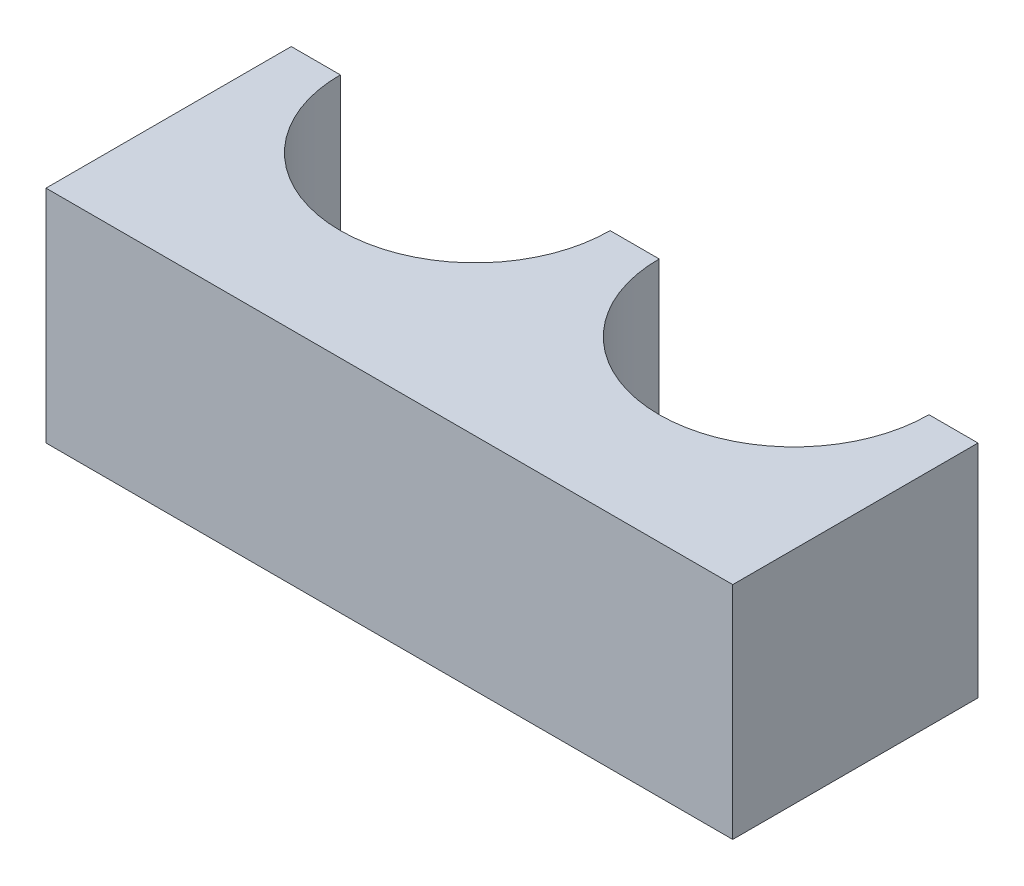
ISO-10303-21;
HEADER;
FILE_DESCRIPTION(('STEP AP214'),'2;1');
FILE_NAME('part.step','',(''),(''),'','','');
FILE_SCHEMA(('AUTOMOTIVE_DESIGN { 1 0 10303 214 1 1 1 1 }'));
ENDSEC;
DATA;
#1=APPLICATION_CONTEXT('core data for automotive mechanical design processes');
#2=APPLICATION_PROTOCOL_DEFINITION('international standard','automotive_design',2000,#1);
#3=PRODUCT_CONTEXT('',#1,'mechanical');
#4=PRODUCT('Part','Part','',(#3));
#5=PRODUCT_RELATED_PRODUCT_CATEGORY('part','',(#4));
#6=PRODUCT_DEFINITION_FORMATION('','',#4);
#7=PRODUCT_DEFINITION_CONTEXT('part definition',#1,'design');
#8=PRODUCT_DEFINITION('design','',#6,#7);
#9=PRODUCT_DEFINITION_SHAPE('','',#8);
#10=(LENGTH_UNIT() NAMED_UNIT(*) SI_UNIT(.MILLI.,.METRE.));
#11=(NAMED_UNIT(*) PLANE_ANGLE_UNIT() SI_UNIT($,.RADIAN.));
#12=(NAMED_UNIT(*) SI_UNIT($,.STERADIAN.) SOLID_ANGLE_UNIT());
#13=UNCERTAINTY_MEASURE_WITH_UNIT(LENGTH_MEASURE(1.E-05),#10,'distance_accuracy_value','');
#14=(GEOMETRIC_REPRESENTATION_CONTEXT(3) GLOBAL_UNCERTAINTY_ASSIGNED_CONTEXT((#13)) GLOBAL_UNIT_ASSIGNED_CONTEXT((#10,
#11,#12)) REPRESENTATION_CONTEXT('',''));
#15=CARTESIAN_POINT('',(0.,0.,0.));
#16=DIRECTION('',(0.,0.,1.));
#17=DIRECTION('',(1.,0.,0.));
#18=AXIS2_PLACEMENT_3D('',#15,#16,#17);
#19=CARTESIAN_POINT('',(0.,0.,0.));
#20=DIRECTION('',(0.,0.,-1.));
#21=DIRECTION('',(-1.,0.,0.));
#22=AXIS2_PLACEMENT_3D('',#19,#20,#21);
#23=PLANE('',#22);
#24=DIRECTION('',(0.,-1.,0.));
#25=VECTOR('',#24,1.);
#26=CARTESIAN_POINT('',(-1000.,4500.001,0.));
#27=LINE('',#26,#25);
#28=CARTESIAN_POINT('',(-1000.,4500.,0.));
#29=VERTEX_POINT('',#28);
#30=CARTESIAN_POINT('',(-1000.,-4500.,0.));
#31=VERTEX_POINT('',#30);
#32=EDGE_CURVE('E112',#29,#31,#27,.T.);
#33=ORIENTED_EDGE('',*,*,#32,.F.);
#34=DIRECTION('',(-1.,0.,0.));
#35=VECTOR('',#34,1.);
#36=CARTESIAN_POINT('',(-14000.,4500.,0.));
#37=LINE('',#36,#35);
#38=CARTESIAN_POINT('',(1000.,4500.,0.));
#39=VERTEX_POINT('',#38);
#40=EDGE_CURVE('E122',#39,#29,#37,.T.);
#41=ORIENTED_EDGE('',*,*,#40,.F.);
#42=DIRECTION('',(0.,-1.,0.));
#43=VECTOR('',#42,1.);
#44=CARTESIAN_POINT('',(1000.,4500.001,0.));
#45=LINE('',#44,#43);
#46=CARTESIAN_POINT('',(1000.,-4500.,0.));
#47=VERTEX_POINT('',#46);
#48=EDGE_CURVE('E182',#39,#47,#45,.T.);
#49=ORIENTED_EDGE('',*,*,#48,.T.);
#50=DIRECTION('',(1.,0.,0.));
#51=VECTOR('',#50,1.);
#52=CARTESIAN_POINT('',(-14000.,-4500.,0.));
#53=LINE('',#52,#51);
#54=EDGE_CURVE('E146',#31,#47,#53,.T.);
#55=ORIENTED_EDGE('',*,*,#54,.F.);
#56=EDGE_LOOP('',(#33,#41,#49,#55));
#57=FACE_BOUND('',#56,.T.);
#58=ADVANCED_FACE('F39',(#57),#23,.T.);
#59=DIRECTION('',(0.,-1.,0.));
#60=VECTOR('',#59,1.);
#61=CARTESIAN_POINT('',(12000.,4500.001,0.));
#62=LINE('',#61,#60);
#63=CARTESIAN_POINT('',(12000.,4500.,0.));
#64=VERTEX_POINT('',#63);
#65=CARTESIAN_POINT('',(12000.,-4500.,0.));
#66=VERTEX_POINT('',#65);
#67=EDGE_CURVE('E124',#64,#66,#62,.T.);
#68=ORIENTED_EDGE('',*,*,#67,.F.);
#69=CARTESIAN_POINT('',(14000.,4500.,0.));
#70=VERTEX_POINT('',#69);
#71=EDGE_CURVE('E132',#70,#64,#37,.T.);
#72=ORIENTED_EDGE('',*,*,#71,.F.);
#73=DIRECTION('',(0.,1.,0.));
#74=VECTOR('',#73,1.);
#75=CARTESIAN_POINT('',(14000.,-4500.,0.));
#76=LINE('',#75,#74);
#77=CARTESIAN_POINT('',(14000.,-4500.,0.));
#78=VERTEX_POINT('',#77);
#79=EDGE_CURVE('E130',#78,#70,#76,.T.);
#80=ORIENTED_EDGE('',*,*,#79,.F.);
#81=EDGE_CURVE('E141',#66,#78,#53,.T.);
#82=ORIENTED_EDGE('',*,*,#81,.F.);
#83=EDGE_LOOP('',(#68,#72,#80,#82));
#84=FACE_BOUND('',#83,.T.);
#85=ADVANCED_FACE('F180',(#84),#23,.T.);
#86=CARTESIAN_POINT('',(14000.,-4500.,10000.));
#87=DIRECTION('',(-1.,0.,0.));
#88=DIRECTION('',(0.,0.,1.));
#89=AXIS2_PLACEMENT_3D('',#86,#87,#88);
#90=PLANE('',#89);
#91=ORIENTED_EDGE('',*,*,#79,.T.);
#92=DIRECTION('',(0.,0.,-1.));
#93=VECTOR('',#92,1.);
#94=CARTESIAN_POINT('',(14000.,4500.,10000.));
#95=LINE('',#94,#93);
#96=CARTESIAN_POINT('',(14000.,4500.,10000.));
#97=VERTEX_POINT('',#96);
#98=EDGE_CURVE('E11',#97,#70,#95,.T.);
#99=ORIENTED_EDGE('',*,*,#98,.F.);
#100=DIRECTION('',(0.,1.,0.));
#101=VECTOR('',#100,1.);
#102=CARTESIAN_POINT('',(14000.,-4500.,10000.));
#103=LINE('',#102,#101);
#104=CARTESIAN_POINT('',(14000.,-4500.,10000.));
#105=VERTEX_POINT('',#104);
#106=EDGE_CURVE('E151',#105,#97,#103,.T.);
#107=ORIENTED_EDGE('',*,*,#106,.F.);
#108=DIRECTION('',(0.,0.,-1.));
#109=VECTOR('',#108,1.);
#110=CARTESIAN_POINT('',(14000.,-4500.,10000.));
#111=LINE('',#110,#109);
#112=EDGE_CURVE('E152',#105,#78,#111,.T.);
#113=ORIENTED_EDGE('',*,*,#112,.T.);
#114=EDGE_LOOP('',(#91,#99,#107,#113));
#115=FACE_BOUND('',#114,.T.);
#116=ADVANCED_FACE('F41',(#115),#90,.F.);
#117=CARTESIAN_POINT('',(-14000.,4500.,10000.));
#118=DIRECTION('',(0.,-1.,0.));
#119=DIRECTION('',(0.,0.,-1.));
#120=AXIS2_PLACEMENT_3D('',#117,#118,#119);
#121=PLANE('',#120);
#122=ORIENTED_EDGE('',*,*,#40,.T.);
#123=CARTESIAN_POINT('',(-6500.,4500.,0.));
#124=DIRECTION('',(0.,-1.,0.));
#125=DIRECTION('',(0.,0.,-1.));
#126=AXIS2_PLACEMENT_3D('',#123,#124,#125);
#127=CIRCLE('',#126,5500.);
#128=CARTESIAN_POINT('',(-12000.,4500.,0.));
#129=VERTEX_POINT('',#128);
#130=EDGE_CURVE('E105',#129,#29,#127,.F.);
#131=ORIENTED_EDGE('',*,*,#130,.F.);
#132=CARTESIAN_POINT('',(-14000.,4500.,0.));
#133=VERTEX_POINT('',#132);
#134=EDGE_CURVE('E118',#129,#133,#37,.T.);
#135=ORIENTED_EDGE('',*,*,#134,.T.);
#136=DIRECTION('',(0.,0.,-1.));
#137=VECTOR('',#136,1.);
#138=CARTESIAN_POINT('',(-14000.,4500.,10000.));
#139=LINE('',#138,#137);
#140=CARTESIAN_POINT('',(-14000.,4500.,10000.));
#141=VERTEX_POINT('',#140);
#142=EDGE_CURVE('E48',#141,#133,#139,.T.);
#143=ORIENTED_EDGE('',*,*,#142,.F.);
#144=DIRECTION('',(-1.,0.,0.));
#145=VECTOR('',#144,1.);
#146=CARTESIAN_POINT('',(-14000.,4500.,10000.));
#147=LINE('',#146,#145);
#148=EDGE_CURVE('E163',#97,#141,#147,.T.);
#149=ORIENTED_EDGE('',*,*,#148,.F.);
#150=ORIENTED_EDGE('',*,*,#98,.T.);
#151=ORIENTED_EDGE('',*,*,#71,.T.);
#152=CARTESIAN_POINT('',(6500.,4500.,0.));
#153=DIRECTION('',(0.,-1.,0.));
#154=DIRECTION('',(0.,0.,-1.));
#155=AXIS2_PLACEMENT_3D('',#152,#153,#154);
#156=CIRCLE('',#155,5500.);
#157=EDGE_CURVE('E199',#39,#64,#156,.F.);
#158=ORIENTED_EDGE('',*,*,#157,.F.);
#159=EDGE_LOOP('',(#122,#131,#135,#143,#149,#150,#151,#158));
#160=FACE_BOUND('',#159,.T.);
#161=ADVANCED_FACE('F116',(#160),#121,.F.);
#162=CARTESIAN_POINT('',(-14000.,-4500.,10000.));
#163=DIRECTION('',(1.,0.,0.));
#164=DIRECTION('',(0.,0.,-1.));
#165=AXIS2_PLACEMENT_3D('',#162,#163,#164);
#166=PLANE('',#165);
#167=DIRECTION('',(0.,-1.,0.));
#168=VECTOR('',#167,1.);
#169=CARTESIAN_POINT('',(-14000.,-4500.,0.));
#170=LINE('',#169,#168);
#171=CARTESIAN_POINT('',(-14000.,-4500.,0.));
#172=VERTEX_POINT('',#171);
#173=EDGE_CURVE('E128',#133,#172,#170,.T.);
#174=ORIENTED_EDGE('',*,*,#173,.T.);
#175=DIRECTION('',(0.,0.,-1.));
#176=VECTOR('',#175,1.);
#177=CARTESIAN_POINT('',(-14000.,-4500.,10000.));
#178=LINE('',#177,#176);
#179=CARTESIAN_POINT('',(-14000.,-4500.,10000.));
#180=VERTEX_POINT('',#179);
#181=EDGE_CURVE('E156',#180,#172,#178,.T.);
#182=ORIENTED_EDGE('',*,*,#181,.F.);
#183=DIRECTION('',(0.,-1.,0.));
#184=VECTOR('',#183,1.);
#185=CARTESIAN_POINT('',(-14000.,-4500.,10000.));
#186=LINE('',#185,#184);
#187=EDGE_CURVE('E162',#141,#180,#186,.T.);
#188=ORIENTED_EDGE('',*,*,#187,.F.);
#189=ORIENTED_EDGE('',*,*,#142,.T.);
#190=EDGE_LOOP('',(#174,#182,#188,#189));
#191=FACE_BOUND('',#190,.T.);
#192=ADVANCED_FACE('F161',(#191),#166,.F.);
#193=CARTESIAN_POINT('',(-14000.,-4500.,10000.));
#194=DIRECTION('',(0.,1.,0.));
#195=DIRECTION('',(0.,0.,1.));
#196=AXIS2_PLACEMENT_3D('',#193,#194,#195);
#197=PLANE('',#196);
#198=CARTESIAN_POINT('',(-12000.,-4500.,0.));
#199=VERTEX_POINT('',#198);
#200=EDGE_CURVE('E148',#172,#199,#53,.T.);
#201=ORIENTED_EDGE('',*,*,#200,.T.);
#202=CARTESIAN_POINT('',(-6500.,-4500.,0.));
#203=DIRECTION('',(0.,-1.,0.));
#204=DIRECTION('',(0.,0.,1.));
#205=AXIS2_PLACEMENT_3D('',#202,#203,#204);
#206=CIRCLE('',#205,5500.);
#207=EDGE_CURVE('E63',#31,#199,#206,.T.);
#208=ORIENTED_EDGE('',*,*,#207,.F.);
#209=ORIENTED_EDGE('',*,*,#54,.T.);
#210=CARTESIAN_POINT('',(6500.,-4500.,0.));
#211=DIRECTION('',(0.,-1.,0.));
#212=DIRECTION('',(0.,0.,1.));
#213=AXIS2_PLACEMENT_3D('',#210,#211,#212);
#214=CIRCLE('',#213,5500.);
#215=EDGE_CURVE('E55',#66,#47,#214,.T.);
#216=ORIENTED_EDGE('',*,*,#215,.F.);
#217=ORIENTED_EDGE('',*,*,#81,.T.);
#218=ORIENTED_EDGE('',*,*,#112,.F.);
#219=DIRECTION('',(1.,0.,0.));
#220=VECTOR('',#219,1.);
#221=CARTESIAN_POINT('',(-14000.,-4500.,10000.));
#222=LINE('',#221,#220);
#223=EDGE_CURVE('E157',#180,#105,#222,.T.);
#224=ORIENTED_EDGE('',*,*,#223,.F.);
#225=ORIENTED_EDGE('',*,*,#181,.T.);
#226=EDGE_LOOP('',(#201,#208,#209,#216,#217,#218,#224,#225));
#227=FACE_BOUND('',#226,.T.);
#228=ADVANCED_FACE('F196',(#227),#197,.F.);
#229=CARTESIAN_POINT('',(0.,0.,10000.));
#230=DIRECTION('',(0.,0.,-1.));
#231=DIRECTION('',(-1.,0.,0.));
#232=AXIS2_PLACEMENT_3D('',#229,#230,#231);
#233=PLANE('',#232);
#234=ORIENTED_EDGE('',*,*,#106,.T.);
#235=ORIENTED_EDGE('',*,*,#148,.T.);
#236=ORIENTED_EDGE('',*,*,#187,.T.);
#237=ORIENTED_EDGE('',*,*,#223,.T.);
#238=EDGE_LOOP('',(#234,#235,#236,#237));
#239=FACE_BOUND('',#238,.T.);
#240=ADVANCED_FACE('F170',(#239),#233,.F.);
#241=DIRECTION('',(0.,-1.,0.));
#242=VECTOR('',#241,1.);
#243=CARTESIAN_POINT('',(-12000.,4500.001,0.));
#244=LINE('',#243,#242);
#245=EDGE_CURVE('E102',#129,#199,#244,.T.);
#246=ORIENTED_EDGE('',*,*,#245,.T.);
#247=ORIENTED_EDGE('',*,*,#200,.F.);
#248=ORIENTED_EDGE('',*,*,#173,.F.);
#249=ORIENTED_EDGE('',*,*,#134,.F.);
#250=EDGE_LOOP('',(#246,#247,#248,#249));
#251=FACE_BOUND('',#250,.T.);
#252=ADVANCED_FACE('F127',(#251),#23,.T.);
#253=CARTESIAN_POINT('',(6500.,4500.001,0.));
#254=DIRECTION('',(0.,-1.,0.));
#255=DIRECTION('',(0.,0.,-1.));
#256=AXIS2_PLACEMENT_3D('',#253,#254,#255);
#257=CYLINDRICAL_SURFACE('',#256,5500.);
#258=ORIENTED_EDGE('',*,*,#157,.T.);
#259=ORIENTED_EDGE('',*,*,#67,.T.);
#260=ORIENTED_EDGE('',*,*,#215,.T.);
#261=ORIENTED_EDGE('',*,*,#48,.F.);
#262=EDGE_LOOP('',(#258,#259,#260,#261));
#263=FACE_BOUND('',#262,.T.);
#264=ADVANCED_FACE('F198',(#263),#257,.F.);
#265=CARTESIAN_POINT('',(-6500.,4500.001,0.));
#266=DIRECTION('',(0.,-1.,0.));
#267=DIRECTION('',(0.,0.,-1.));
#268=AXIS2_PLACEMENT_3D('',#265,#266,#267);
#269=CYLINDRICAL_SURFACE('',#268,5500.);
#270=ORIENTED_EDGE('',*,*,#130,.T.);
#271=ORIENTED_EDGE('',*,*,#32,.T.);
#272=ORIENTED_EDGE('',*,*,#207,.T.);
#273=ORIENTED_EDGE('',*,*,#245,.F.);
#274=EDGE_LOOP('',(#270,#271,#272,#273));
#275=FACE_BOUND('',#274,.T.);
#276=ADVANCED_FACE('F104',(#275),#269,.F.);
#277=CLOSED_SHELL('',(#58,#85,#116,#161,#192,#228,#240,#252,#264,#276));
#278=MANIFOLD_SOLID_BREP('B2',#277);
#279=ADVANCED_BREP_SHAPE_REPRESENTATION('',(#18,#278),#14);
#280=SHAPE_DEFINITION_REPRESENTATION(#9,#279);
ENDSEC;
END-ISO-10303-21;
